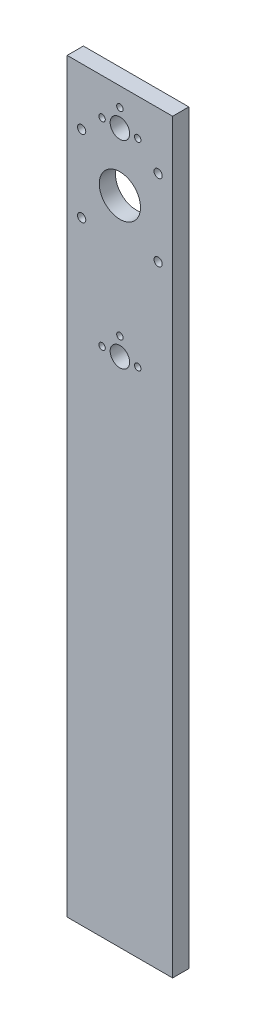
ISO-10303-21;
HEADER;
FILE_DESCRIPTION(('STEP AP214'),'2;1');
FILE_NAME('part.step','',(''),(''),'','','');
FILE_SCHEMA(('AUTOMOTIVE_DESIGN { 1 0 10303 214 1 1 1 1 }'));
ENDSEC;
DATA;
#1=APPLICATION_CONTEXT('core data for automotive mechanical design processes');
#2=APPLICATION_PROTOCOL_DEFINITION('international standard','automotive_design',2000,#1);
#3=PRODUCT_CONTEXT('',#1,'mechanical');
#4=PRODUCT('Part','Part','',(#3));
#5=PRODUCT_RELATED_PRODUCT_CATEGORY('part','',(#4));
#6=PRODUCT_DEFINITION_FORMATION('','',#4);
#7=PRODUCT_DEFINITION_CONTEXT('part definition',#1,'design');
#8=PRODUCT_DEFINITION('design','',#6,#7);
#9=PRODUCT_DEFINITION_SHAPE('','',#8);
#10=(LENGTH_UNIT() NAMED_UNIT(*) SI_UNIT(.MILLI.,.METRE.));
#11=(NAMED_UNIT(*) PLANE_ANGLE_UNIT() SI_UNIT($,.RADIAN.));
#12=(NAMED_UNIT(*) SI_UNIT($,.STERADIAN.) SOLID_ANGLE_UNIT());
#13=UNCERTAINTY_MEASURE_WITH_UNIT(LENGTH_MEASURE(1.E-05),#10,'distance_accuracy_value','');
#14=(GEOMETRIC_REPRESENTATION_CONTEXT(3) GLOBAL_UNCERTAINTY_ASSIGNED_CONTEXT((#13)) GLOBAL_UNIT_ASSIGNED_CONTEXT((#10,
#11,#12)) REPRESENTATION_CONTEXT('',''));
#15=CARTESIAN_POINT('',(0.,0.,0.));
#16=DIRECTION('',(0.,0.,1.));
#17=DIRECTION('',(1.,0.,0.));
#18=AXIS2_PLACEMENT_3D('',#15,#16,#17);
#19=CARTESIAN_POINT('',(-32.5,38.575,10.));
#20=DIRECTION('',(0.,0.,-1.));
#21=DIRECTION('',(-1.,0.,0.));
#22=AXIS2_PLACEMENT_3D('',#19,#20,#21);
#23=PLANE('',#22);
#24=CARTESIAN_POINT('',(-4.25960723338862E-13,27.,10.));
#25=DIRECTION('',(0.,0.,1.));
#26=DIRECTION('',(1.,0.,0.));
#27=AXIS2_PLACEMENT_3D('',#24,#25,#26);
#28=CIRCLE('',#27,2.);
#29=CARTESIAN_POINT('',(1.99999999999957,27.,10.));
#30=VERTEX_POINT('',#29);
#31=EDGE_CURVE('E175',#30,#30,#28,.T.);
#32=ORIENTED_EDGE('',*,*,#31,.F.);
#33=EDGE_LOOP('',(#32));
#34=FACE_BOUND('',#33,.T.);
#35=CARTESIAN_POINT('',(-11.,-106.,10.));
#36=DIRECTION('',(0.,0.,1.));
#37=DIRECTION('',(1.,0.,0.));
#38=AXIS2_PLACEMENT_3D('',#35,#36,#37);
#39=CIRCLE('',#38,2.);
#40=CARTESIAN_POINT('',(-9.,-106.,10.));
#41=VERTEX_POINT('',#40);
#42=EDGE_CURVE('E163',#41,#41,#39,.T.);
#43=ORIENTED_EDGE('',*,*,#42,.F.);
#44=EDGE_LOOP('',(#43));
#45=FACE_BOUND('',#44,.T.);
#46=CARTESIAN_POINT('',(-4.25960723338862E-13,16.,10.));
#47=DIRECTION('',(0.,0.,1.));
#48=DIRECTION('',(1.,0.,0.));
#49=AXIS2_PLACEMENT_3D('',#46,#47,#48);
#50=CIRCLE('',#49,6.);
#51=CARTESIAN_POINT('',(5.99999999999958,16.,10.));
#52=VERTEX_POINT('',#51);
#53=EDGE_CURVE('E151',#52,#52,#50,.T.);
#54=ORIENTED_EDGE('',*,*,#53,.F.);
#55=EDGE_LOOP('',(#54));
#56=FACE_BOUND('',#55,.T.);
#57=CARTESIAN_POINT('',(0.,-106.,10.));
#58=DIRECTION('',(0.,0.,1.));
#59=DIRECTION('',(1.,0.,0.));
#60=AXIS2_PLACEMENT_3D('',#57,#58,#59);
#61=CIRCLE('',#60,6.);
#62=CARTESIAN_POINT('',(6.,-106.,10.));
#63=VERTEX_POINT('',#62);
#64=EDGE_CURVE('E139',#63,#63,#61,.T.);
#65=ORIENTED_EDGE('',*,*,#64,.F.);
#66=EDGE_LOOP('',(#65));
#67=FACE_BOUND('',#66,.T.);
#68=CARTESIAN_POINT('',(-23.5712,-43.5712,10.));
#69=DIRECTION('',(0.,0.,1.));
#70=DIRECTION('',(1.,0.,0.));
#71=AXIS2_PLACEMENT_3D('',#68,#69,#70);
#72=CIRCLE('',#71,2.54);
#73=CARTESIAN_POINT('',(-21.0312,-43.5712,10.));
#74=VERTEX_POINT('',#73);
#75=EDGE_CURVE('E127',#74,#74,#72,.T.);
#76=ORIENTED_EDGE('',*,*,#75,.F.);
#77=EDGE_LOOP('',(#76));
#78=FACE_BOUND('',#77,.T.);
#79=CARTESIAN_POINT('',(23.5712,3.57119999999999,10.));
#80=DIRECTION('',(0.,0.,1.));
#81=DIRECTION('',(1.,0.,0.));
#82=AXIS2_PLACEMENT_3D('',#79,#80,#81);
#83=CIRCLE('',#82,2.54);
#84=CARTESIAN_POINT('',(26.1112,3.57119999999999,10.));
#85=VERTEX_POINT('',#84);
#86=EDGE_CURVE('E115',#85,#85,#83,.T.);
#87=ORIENTED_EDGE('',*,*,#86,.F.);
#88=EDGE_LOOP('',(#87));
#89=FACE_BOUND('',#88,.T.);
#90=DIRECTION('',(0.,-1.,0.));
#91=VECTOR('',#90,1.);
#92=CARTESIAN_POINT('',(-32.5,-421.425,10.));
#93=LINE('',#92,#91);
#94=CARTESIAN_POINT('',(-32.5,38.575,10.));
#95=VERTEX_POINT('',#94);
#96=CARTESIAN_POINT('',(-32.5,-421.425,10.));
#97=VERTEX_POINT('',#96);
#98=EDGE_CURVE('E85',#95,#97,#93,.T.);
#99=ORIENTED_EDGE('',*,*,#98,.T.);
#100=DIRECTION('',(1.,0.,0.));
#101=VECTOR('',#100,1.);
#102=CARTESIAN_POINT('',(-32.5,-421.425,10.));
#103=LINE('',#102,#101);
#104=CARTESIAN_POINT('',(32.5,-421.425,10.));
#105=VERTEX_POINT('',#104);
#106=EDGE_CURVE('E80',#97,#105,#103,.T.);
#107=ORIENTED_EDGE('',*,*,#106,.T.);
#108=DIRECTION('',(0.,1.,0.));
#109=VECTOR('',#108,1.);
#110=CARTESIAN_POINT('',(32.5,-421.425,10.));
#111=LINE('',#110,#109);
#112=CARTESIAN_POINT('',(32.5,38.575,10.));
#113=VERTEX_POINT('',#112);
#114=EDGE_CURVE('E83',#105,#113,#111,.T.);
#115=ORIENTED_EDGE('',*,*,#114,.T.);
#116=DIRECTION('',(-1.,0.,0.));
#117=VECTOR('',#116,1.);
#118=CARTESIAN_POINT('',(-32.5,38.575,10.));
#119=LINE('',#118,#117);
#120=EDGE_CURVE('E50',#113,#95,#119,.T.);
#121=ORIENTED_EDGE('',*,*,#120,.T.);
#122=EDGE_LOOP('',(#99,#107,#115,#121));
#123=FACE_BOUND('',#122,.T.);
#124=CARTESIAN_POINT('',(-23.5712,3.57119999999998,10.));
#125=DIRECTION('',(0.,0.,1.));
#126=DIRECTION('',(1.,0.,0.));
#127=AXIS2_PLACEMENT_3D('',#124,#125,#126);
#128=CIRCLE('',#127,2.54);
#129=CARTESIAN_POINT('',(-21.0312,3.57119999999998,10.));
#130=VERTEX_POINT('',#129);
#131=EDGE_CURVE('E100',#130,#130,#128,.T.);
#132=ORIENTED_EDGE('',*,*,#131,.F.);
#133=EDGE_LOOP('',(#132));
#134=FACE_BOUND('',#133,.T.);
#135=CARTESIAN_POINT('',(23.5712,-43.5712,10.));
#136=DIRECTION('',(0.,0.,1.));
#137=DIRECTION('',(1.,0.,0.));
#138=AXIS2_PLACEMENT_3D('',#135,#136,#137);
#139=CIRCLE('',#138,2.54);
#140=CARTESIAN_POINT('',(26.1112,-43.5712,10.));
#141=VERTEX_POINT('',#140);
#142=EDGE_CURVE('E121',#141,#141,#139,.T.);
#143=ORIENTED_EDGE('',*,*,#142,.F.);
#144=EDGE_LOOP('',(#143));
#145=FACE_BOUND('',#144,.T.);
#146=CARTESIAN_POINT('',(0.,-20.,10.));
#147=DIRECTION('',(0.,0.,1.));
#148=DIRECTION('',(1.,0.,0.));
#149=AXIS2_PLACEMENT_3D('',#146,#147,#148);
#150=CIRCLE('',#149,12.7);
#151=CARTESIAN_POINT('',(12.7,-20.,10.));
#152=VERTEX_POINT('',#151);
#153=EDGE_CURVE('E133',#152,#152,#150,.T.);
#154=ORIENTED_EDGE('',*,*,#153,.F.);
#155=EDGE_LOOP('',(#154));
#156=FACE_BOUND('',#155,.T.);
#157=CARTESIAN_POINT('',(11.,-106.,10.));
#158=DIRECTION('',(0.,0.,1.));
#159=DIRECTION('',(1.,0.,0.));
#160=AXIS2_PLACEMENT_3D('',#157,#158,#159);
#161=CIRCLE('',#160,2.);
#162=CARTESIAN_POINT('',(13.,-106.,10.));
#163=VERTEX_POINT('',#162);
#164=EDGE_CURVE('E145',#163,#163,#161,.T.);
#165=ORIENTED_EDGE('',*,*,#164,.F.);
#166=EDGE_LOOP('',(#165));
#167=FACE_BOUND('',#166,.T.);
#168=CARTESIAN_POINT('',(0.,-95.,10.));
#169=DIRECTION('',(0.,0.,1.));
#170=DIRECTION('',(1.,0.,0.));
#171=AXIS2_PLACEMENT_3D('',#168,#169,#170);
#172=CIRCLE('',#171,2.);
#173=CARTESIAN_POINT('',(2.,-95.,10.));
#174=VERTEX_POINT('',#173);
#175=EDGE_CURVE('E157',#174,#174,#172,.T.);
#176=ORIENTED_EDGE('',*,*,#175,.F.);
#177=EDGE_LOOP('',(#176));
#178=FACE_BOUND('',#177,.T.);
#179=CARTESIAN_POINT('',(10.9999999999996,16.,10.));
#180=DIRECTION('',(0.,0.,1.));
#181=DIRECTION('',(1.,0.,0.));
#182=AXIS2_PLACEMENT_3D('',#179,#180,#181);
#183=CIRCLE('',#182,2.);
#184=CARTESIAN_POINT('',(12.9999999999996,16.,10.));
#185=VERTEX_POINT('',#184);
#186=EDGE_CURVE('E169',#185,#185,#183,.T.);
#187=ORIENTED_EDGE('',*,*,#186,.F.);
#188=EDGE_LOOP('',(#187));
#189=FACE_BOUND('',#188,.T.);
#190=CARTESIAN_POINT('',(-11.0000000000004,16.,10.));
#191=DIRECTION('',(0.,0.,1.));
#192=DIRECTION('',(1.,0.,0.));
#193=AXIS2_PLACEMENT_3D('',#190,#191,#192);
#194=CIRCLE('',#193,2.);
#195=CARTESIAN_POINT('',(-9.00000000000042,16.,10.));
#196=VERTEX_POINT('',#195);
#197=EDGE_CURVE('E181',#196,#196,#194,.T.);
#198=ORIENTED_EDGE('',*,*,#197,.F.);
#199=EDGE_LOOP('',(#198));
#200=FACE_BOUND('',#199,.T.);
#201=ADVANCED_FACE('F33',(#34,#45,#56,#67,#78,#89,#123,#134,#145,#156,#167,#178,#189,#200),#23,.F.);
#202=CARTESIAN_POINT('',(-32.5,38.575,0.));
#203=DIRECTION('',(0.,0.,-1.));
#204=DIRECTION('',(-1.,0.,0.));
#205=AXIS2_PLACEMENT_3D('',#202,#203,#204);
#206=PLANE('',#205);
#207=CARTESIAN_POINT('',(-4.25960723338862E-13,27.,0.));
#208=DIRECTION('',(0.,0.,1.));
#209=DIRECTION('',(1.,0.,0.));
#210=AXIS2_PLACEMENT_3D('',#207,#208,#209);
#211=CIRCLE('',#210,2.);
#212=CARTESIAN_POINT('',(1.99999999999957,27.,0.));
#213=VERTEX_POINT('',#212);
#214=EDGE_CURVE('E178',#213,#213,#211,.T.);
#215=ORIENTED_EDGE('',*,*,#214,.T.);
#216=EDGE_LOOP('',(#215));
#217=FACE_BOUND('',#216,.T.);
#218=CARTESIAN_POINT('',(-11.,-106.,0.));
#219=DIRECTION('',(0.,0.,1.));
#220=DIRECTION('',(1.,0.,0.));
#221=AXIS2_PLACEMENT_3D('',#218,#219,#220);
#222=CIRCLE('',#221,2.);
#223=CARTESIAN_POINT('',(-9.,-106.,0.));
#224=VERTEX_POINT('',#223);
#225=EDGE_CURVE('E166',#224,#224,#222,.T.);
#226=ORIENTED_EDGE('',*,*,#225,.T.);
#227=EDGE_LOOP('',(#226));
#228=FACE_BOUND('',#227,.T.);
#229=CARTESIAN_POINT('',(-4.25960723338862E-13,16.,0.));
#230=DIRECTION('',(0.,0.,1.));
#231=DIRECTION('',(1.,0.,0.));
#232=AXIS2_PLACEMENT_3D('',#229,#230,#231);
#233=CIRCLE('',#232,6.);
#234=CARTESIAN_POINT('',(5.99999999999958,16.,0.));
#235=VERTEX_POINT('',#234);
#236=EDGE_CURVE('E154',#235,#235,#233,.T.);
#237=ORIENTED_EDGE('',*,*,#236,.T.);
#238=EDGE_LOOP('',(#237));
#239=FACE_BOUND('',#238,.T.);
#240=CARTESIAN_POINT('',(0.,-106.,0.));
#241=DIRECTION('',(0.,0.,1.));
#242=DIRECTION('',(1.,0.,0.));
#243=AXIS2_PLACEMENT_3D('',#240,#241,#242);
#244=CIRCLE('',#243,6.);
#245=CARTESIAN_POINT('',(6.,-106.,0.));
#246=VERTEX_POINT('',#245);
#247=EDGE_CURVE('E142',#246,#246,#244,.T.);
#248=ORIENTED_EDGE('',*,*,#247,.T.);
#249=EDGE_LOOP('',(#248));
#250=FACE_BOUND('',#249,.T.);
#251=CARTESIAN_POINT('',(-23.5712,-43.5712,0.));
#252=DIRECTION('',(0.,0.,1.));
#253=DIRECTION('',(1.,0.,0.));
#254=AXIS2_PLACEMENT_3D('',#251,#252,#253);
#255=CIRCLE('',#254,2.54);
#256=CARTESIAN_POINT('',(-21.0312,-43.5712,0.));
#257=VERTEX_POINT('',#256);
#258=EDGE_CURVE('E130',#257,#257,#255,.T.);
#259=ORIENTED_EDGE('',*,*,#258,.T.);
#260=EDGE_LOOP('',(#259));
#261=FACE_BOUND('',#260,.T.);
#262=CARTESIAN_POINT('',(23.5712,3.57119999999999,0.));
#263=DIRECTION('',(0.,0.,1.));
#264=DIRECTION('',(1.,0.,0.));
#265=AXIS2_PLACEMENT_3D('',#262,#263,#264);
#266=CIRCLE('',#265,2.54);
#267=CARTESIAN_POINT('',(26.1112,3.57119999999999,0.));
#268=VERTEX_POINT('',#267);
#269=EDGE_CURVE('E118',#268,#268,#266,.T.);
#270=ORIENTED_EDGE('',*,*,#269,.T.);
#271=EDGE_LOOP('',(#270));
#272=FACE_BOUND('',#271,.T.);
#273=DIRECTION('',(0.,-1.,0.));
#274=VECTOR('',#273,1.);
#275=CARTESIAN_POINT('',(-32.5,-421.425,0.));
#276=LINE('',#275,#274);
#277=CARTESIAN_POINT('',(-32.5,38.575,0.));
#278=VERTEX_POINT('',#277);
#279=CARTESIAN_POINT('',(-32.5,-421.425,0.));
#280=VERTEX_POINT('',#279);
#281=EDGE_CURVE('E97',#278,#280,#276,.T.);
#282=ORIENTED_EDGE('',*,*,#281,.F.);
#283=DIRECTION('',(-1.,0.,0.));
#284=VECTOR('',#283,1.);
#285=CARTESIAN_POINT('',(-32.5,38.575,0.));
#286=LINE('',#285,#284);
#287=CARTESIAN_POINT('',(32.5,38.575,0.));
#288=VERTEX_POINT('',#287);
#289=EDGE_CURVE('E73',#288,#278,#286,.T.);
#290=ORIENTED_EDGE('',*,*,#289,.F.);
#291=DIRECTION('',(0.,1.,0.));
#292=VECTOR('',#291,1.);
#293=CARTESIAN_POINT('',(32.5,-421.425,0.));
#294=LINE('',#293,#292);
#295=CARTESIAN_POINT('',(32.5,-421.425,0.));
#296=VERTEX_POINT('',#295);
#297=EDGE_CURVE('E67',#296,#288,#294,.T.);
#298=ORIENTED_EDGE('',*,*,#297,.F.);
#299=DIRECTION('',(1.,0.,0.));
#300=VECTOR('',#299,1.);
#301=CARTESIAN_POINT('',(-32.5,-421.425,0.));
#302=LINE('',#301,#300);
#303=EDGE_CURVE('E89',#280,#296,#302,.T.);
#304=ORIENTED_EDGE('',*,*,#303,.F.);
#305=EDGE_LOOP('',(#282,#290,#298,#304));
#306=FACE_BOUND('',#305,.T.);
#307=CARTESIAN_POINT('',(-23.5712,3.57119999999998,0.));
#308=DIRECTION('',(0.,0.,1.));
#309=DIRECTION('',(1.,0.,0.));
#310=AXIS2_PLACEMENT_3D('',#307,#308,#309);
#311=CIRCLE('',#310,2.54);
#312=CARTESIAN_POINT('',(-21.0312,3.57119999999998,0.));
#313=VERTEX_POINT('',#312);
#314=EDGE_CURVE('E112',#313,#313,#311,.T.);
#315=ORIENTED_EDGE('',*,*,#314,.T.);
#316=EDGE_LOOP('',(#315));
#317=FACE_BOUND('',#316,.T.);
#318=CARTESIAN_POINT('',(23.5712,-43.5712,0.));
#319=DIRECTION('',(0.,0.,1.));
#320=DIRECTION('',(1.,0.,0.));
#321=AXIS2_PLACEMENT_3D('',#318,#319,#320);
#322=CIRCLE('',#321,2.54);
#323=CARTESIAN_POINT('',(26.1112,-43.5712,0.));
#324=VERTEX_POINT('',#323);
#325=EDGE_CURVE('E124',#324,#324,#322,.T.);
#326=ORIENTED_EDGE('',*,*,#325,.T.);
#327=EDGE_LOOP('',(#326));
#328=FACE_BOUND('',#327,.T.);
#329=CARTESIAN_POINT('',(0.,-20.,0.));
#330=DIRECTION('',(0.,0.,1.));
#331=DIRECTION('',(1.,0.,0.));
#332=AXIS2_PLACEMENT_3D('',#329,#330,#331);
#333=CIRCLE('',#332,12.7);
#334=CARTESIAN_POINT('',(12.7,-20.,0.));
#335=VERTEX_POINT('',#334);
#336=EDGE_CURVE('E136',#335,#335,#333,.T.);
#337=ORIENTED_EDGE('',*,*,#336,.T.);
#338=EDGE_LOOP('',(#337));
#339=FACE_BOUND('',#338,.T.);
#340=CARTESIAN_POINT('',(11.,-106.,0.));
#341=DIRECTION('',(0.,0.,1.));
#342=DIRECTION('',(1.,0.,0.));
#343=AXIS2_PLACEMENT_3D('',#340,#341,#342);
#344=CIRCLE('',#343,2.);
#345=CARTESIAN_POINT('',(13.,-106.,0.));
#346=VERTEX_POINT('',#345);
#347=EDGE_CURVE('E148',#346,#346,#344,.T.);
#348=ORIENTED_EDGE('',*,*,#347,.T.);
#349=EDGE_LOOP('',(#348));
#350=FACE_BOUND('',#349,.T.);
#351=CARTESIAN_POINT('',(0.,-95.,0.));
#352=DIRECTION('',(0.,0.,1.));
#353=DIRECTION('',(1.,0.,0.));
#354=AXIS2_PLACEMENT_3D('',#351,#352,#353);
#355=CIRCLE('',#354,2.);
#356=CARTESIAN_POINT('',(2.,-95.,0.));
#357=VERTEX_POINT('',#356);
#358=EDGE_CURVE('E160',#357,#357,#355,.T.);
#359=ORIENTED_EDGE('',*,*,#358,.T.);
#360=EDGE_LOOP('',(#359));
#361=FACE_BOUND('',#360,.T.);
#362=CARTESIAN_POINT('',(10.9999999999996,16.,0.));
#363=DIRECTION('',(0.,0.,1.));
#364=DIRECTION('',(1.,0.,0.));
#365=AXIS2_PLACEMENT_3D('',#362,#363,#364);
#366=CIRCLE('',#365,2.);
#367=CARTESIAN_POINT('',(12.9999999999996,16.,0.));
#368=VERTEX_POINT('',#367);
#369=EDGE_CURVE('E172',#368,#368,#366,.T.);
#370=ORIENTED_EDGE('',*,*,#369,.T.);
#371=EDGE_LOOP('',(#370));
#372=FACE_BOUND('',#371,.T.);
#373=CARTESIAN_POINT('',(-11.0000000000004,16.,0.));
#374=DIRECTION('',(0.,0.,1.));
#375=DIRECTION('',(1.,0.,0.));
#376=AXIS2_PLACEMENT_3D('',#373,#374,#375);
#377=CIRCLE('',#376,2.);
#378=CARTESIAN_POINT('',(-9.00000000000042,16.,0.));
#379=VERTEX_POINT('',#378);
#380=EDGE_CURVE('E184',#379,#379,#377,.T.);
#381=ORIENTED_EDGE('',*,*,#380,.T.);
#382=EDGE_LOOP('',(#381));
#383=FACE_BOUND('',#382,.T.);
#384=ADVANCED_FACE('F108',(#217,#228,#239,#250,#261,#272,#306,#317,#328,#339,#350,#361,#372,
#383),#206,.T.);
#385=CARTESIAN_POINT('',(-32.5,-421.425,10.));
#386=DIRECTION('',(1.,0.,0.));
#387=DIRECTION('',(0.,0.,-1.));
#388=AXIS2_PLACEMENT_3D('',#385,#386,#387);
#389=PLANE('',#388);
#390=ORIENTED_EDGE('',*,*,#281,.T.);
#391=DIRECTION('',(0.,0.,-1.));
#392=VECTOR('',#391,1.);
#393=CARTESIAN_POINT('',(-32.5,-421.425,10.));
#394=LINE('',#393,#392);
#395=EDGE_CURVE('E11',#97,#280,#394,.T.);
#396=ORIENTED_EDGE('',*,*,#395,.F.);
#397=ORIENTED_EDGE('',*,*,#98,.F.);
#398=DIRECTION('',(0.,0.,-1.));
#399=VECTOR('',#398,1.);
#400=CARTESIAN_POINT('',(-32.5,38.575,10.));
#401=LINE('',#400,#399);
#402=EDGE_CURVE('E93',#95,#278,#401,.T.);
#403=ORIENTED_EDGE('',*,*,#402,.T.);
#404=EDGE_LOOP('',(#390,#396,#397,#403));
#405=FACE_BOUND('',#404,.T.);
#406=ADVANCED_FACE('F35',(#405),#389,.F.);
#407=CARTESIAN_POINT('',(-32.5,-421.425,10.));
#408=DIRECTION('',(0.,1.,0.));
#409=DIRECTION('',(0.,0.,1.));
#410=AXIS2_PLACEMENT_3D('',#407,#408,#409);
#411=PLANE('',#410);
#412=ORIENTED_EDGE('',*,*,#303,.T.);
#413=DIRECTION('',(0.,0.,-1.));
#414=VECTOR('',#413,1.);
#415=CARTESIAN_POINT('',(32.5,-421.425,10.));
#416=LINE('',#415,#414);
#417=EDGE_CURVE('E42',#105,#296,#416,.T.);
#418=ORIENTED_EDGE('',*,*,#417,.F.);
#419=ORIENTED_EDGE('',*,*,#106,.F.);
#420=ORIENTED_EDGE('',*,*,#395,.T.);
#421=EDGE_LOOP('',(#412,#418,#419,#420));
#422=FACE_BOUND('',#421,.T.);
#423=ADVANCED_FACE('F88',(#422),#411,.F.);
#424=CARTESIAN_POINT('',(32.5,-421.425,10.));
#425=DIRECTION('',(-1.,0.,0.));
#426=DIRECTION('',(0.,0.,1.));
#427=AXIS2_PLACEMENT_3D('',#424,#425,#426);
#428=PLANE('',#427);
#429=ORIENTED_EDGE('',*,*,#297,.T.);
#430=DIRECTION('',(0.,0.,-1.));
#431=VECTOR('',#430,1.);
#432=CARTESIAN_POINT('',(32.5,38.575,10.));
#433=LINE('',#432,#431);
#434=EDGE_CURVE('E90',#113,#288,#433,.T.);
#435=ORIENTED_EDGE('',*,*,#434,.F.);
#436=ORIENTED_EDGE('',*,*,#114,.F.);
#437=ORIENTED_EDGE('',*,*,#417,.T.);
#438=EDGE_LOOP('',(#429,#435,#436,#437));
#439=FACE_BOUND('',#438,.T.);
#440=ADVANCED_FACE('F91',(#439),#428,.F.);
#441=CARTESIAN_POINT('',(-32.5,38.575,10.));
#442=DIRECTION('',(0.,-1.,0.));
#443=DIRECTION('',(0.,0.,-1.));
#444=AXIS2_PLACEMENT_3D('',#441,#442,#443);
#445=PLANE('',#444);
#446=ORIENTED_EDGE('',*,*,#289,.T.);
#447=ORIENTED_EDGE('',*,*,#402,.F.);
#448=ORIENTED_EDGE('',*,*,#120,.F.);
#449=ORIENTED_EDGE('',*,*,#434,.T.);
#450=EDGE_LOOP('',(#446,#447,#448,#449));
#451=FACE_BOUND('',#450,.T.);
#452=ADVANCED_FACE('F105',(#451),#445,.F.);
#453=CARTESIAN_POINT('',(-23.5712,3.57119999999998,10.));
#454=DIRECTION('',(0.,0.,-1.));
#455=DIRECTION('',(-1.,0.,0.));
#456=AXIS2_PLACEMENT_3D('',#453,#454,#455);
#457=CYLINDRICAL_SURFACE('',#456,2.54);
#458=ORIENTED_EDGE('',*,*,#131,.T.);
#459=EDGE_LOOP('',(#458));
#460=FACE_BOUND('',#459,.T.);
#461=ORIENTED_EDGE('',*,*,#314,.F.);
#462=EDGE_LOOP('',(#461));
#463=FACE_BOUND('',#462,.T.);
#464=ADVANCED_FACE('F204',(#460,#463),#457,.F.);
#465=CARTESIAN_POINT('',(23.5712,3.57119999999999,10.));
#466=DIRECTION('',(0.,0.,-1.));
#467=DIRECTION('',(-1.,0.,0.));
#468=AXIS2_PLACEMENT_3D('',#465,#466,#467);
#469=CYLINDRICAL_SURFACE('',#468,2.54);
#470=ORIENTED_EDGE('',*,*,#86,.T.);
#471=EDGE_LOOP('',(#470));
#472=FACE_BOUND('',#471,.T.);
#473=ORIENTED_EDGE('',*,*,#269,.F.);
#474=EDGE_LOOP('',(#473));
#475=FACE_BOUND('',#474,.T.);
#476=ADVANCED_FACE('F250',(#472,#475),#469,.F.);
#477=CARTESIAN_POINT('',(23.5712,-43.5712,10.));
#478=DIRECTION('',(0.,0.,-1.));
#479=DIRECTION('',(-1.,0.,0.));
#480=AXIS2_PLACEMENT_3D('',#477,#478,#479);
#481=CYLINDRICAL_SURFACE('',#480,2.54);
#482=ORIENTED_EDGE('',*,*,#142,.T.);
#483=EDGE_LOOP('',(#482));
#484=FACE_BOUND('',#483,.T.);
#485=ORIENTED_EDGE('',*,*,#325,.F.);
#486=EDGE_LOOP('',(#485));
#487=FACE_BOUND('',#486,.T.);
#488=ADVANCED_FACE('F258',(#484,#487),#481,.F.);
#489=CARTESIAN_POINT('',(-23.5712,-43.5712,10.));
#490=DIRECTION('',(0.,0.,-1.));
#491=DIRECTION('',(-1.,0.,0.));
#492=AXIS2_PLACEMENT_3D('',#489,#490,#491);
#493=CYLINDRICAL_SURFACE('',#492,2.54);
#494=ORIENTED_EDGE('',*,*,#75,.T.);
#495=EDGE_LOOP('',(#494));
#496=FACE_BOUND('',#495,.T.);
#497=ORIENTED_EDGE('',*,*,#258,.F.);
#498=EDGE_LOOP('',(#497));
#499=FACE_BOUND('',#498,.T.);
#500=ADVANCED_FACE('F266',(#496,#499),#493,.F.);
#501=CARTESIAN_POINT('',(0.,-20.,10.));
#502=DIRECTION('',(0.,0.,-1.));
#503=DIRECTION('',(-1.,0.,0.));
#504=AXIS2_PLACEMENT_3D('',#501,#502,#503);
#505=CYLINDRICAL_SURFACE('',#504,12.7);
#506=ORIENTED_EDGE('',*,*,#153,.T.);
#507=EDGE_LOOP('',(#506));
#508=FACE_BOUND('',#507,.T.);
#509=ORIENTED_EDGE('',*,*,#336,.F.);
#510=EDGE_LOOP('',(#509));
#511=FACE_BOUND('',#510,.T.);
#512=ADVANCED_FACE('F275',(#508,#511),#505,.F.);
#513=CARTESIAN_POINT('',(0.,-106.,10.));
#514=DIRECTION('',(0.,0.,-1.));
#515=DIRECTION('',(-1.,0.,0.));
#516=AXIS2_PLACEMENT_3D('',#513,#514,#515);
#517=CYLINDRICAL_SURFACE('',#516,6.);
#518=ORIENTED_EDGE('',*,*,#64,.T.);
#519=EDGE_LOOP('',(#518));
#520=FACE_BOUND('',#519,.T.);
#521=ORIENTED_EDGE('',*,*,#247,.F.);
#522=EDGE_LOOP('',(#521));
#523=FACE_BOUND('',#522,.T.);
#524=ADVANCED_FACE('F284',(#520,#523),#517,.F.);
#525=CARTESIAN_POINT('',(11.,-106.,10.));
#526=DIRECTION('',(0.,0.,-1.));
#527=DIRECTION('',(-1.,0.,0.));
#528=AXIS2_PLACEMENT_3D('',#525,#526,#527);
#529=CYLINDRICAL_SURFACE('',#528,2.);
#530=ORIENTED_EDGE('',*,*,#164,.T.);
#531=EDGE_LOOP('',(#530));
#532=FACE_BOUND('',#531,.T.);
#533=ORIENTED_EDGE('',*,*,#347,.F.);
#534=EDGE_LOOP('',(#533));
#535=FACE_BOUND('',#534,.T.);
#536=ADVANCED_FACE('F293',(#532,#535),#529,.F.);
#537=CARTESIAN_POINT('',(-4.25960723338862E-13,16.,10.));
#538=DIRECTION('',(0.,0.,-1.));
#539=DIRECTION('',(-1.,0.,0.));
#540=AXIS2_PLACEMENT_3D('',#537,#538,#539);
#541=CYLINDRICAL_SURFACE('',#540,6.);
#542=ORIENTED_EDGE('',*,*,#53,.T.);
#543=EDGE_LOOP('',(#542));
#544=FACE_BOUND('',#543,.T.);
#545=ORIENTED_EDGE('',*,*,#236,.F.);
#546=EDGE_LOOP('',(#545));
#547=FACE_BOUND('',#546,.T.);
#548=ADVANCED_FACE('F302',(#544,#547),#541,.F.);
#549=CARTESIAN_POINT('',(0.,-95.,10.));
#550=DIRECTION('',(0.,0.,-1.));
#551=DIRECTION('',(-1.,0.,0.));
#552=AXIS2_PLACEMENT_3D('',#549,#550,#551);
#553=CYLINDRICAL_SURFACE('',#552,2.);
#554=ORIENTED_EDGE('',*,*,#175,.T.);
#555=EDGE_LOOP('',(#554));
#556=FACE_BOUND('',#555,.T.);
#557=ORIENTED_EDGE('',*,*,#358,.F.);
#558=EDGE_LOOP('',(#557));
#559=FACE_BOUND('',#558,.T.);
#560=ADVANCED_FACE('F311',(#556,#559),#553,.F.);
#561=CARTESIAN_POINT('',(-11.,-106.,10.));
#562=DIRECTION('',(0.,0.,-1.));
#563=DIRECTION('',(-1.,0.,0.));
#564=AXIS2_PLACEMENT_3D('',#561,#562,#563);
#565=CYLINDRICAL_SURFACE('',#564,2.);
#566=ORIENTED_EDGE('',*,*,#42,.T.);
#567=EDGE_LOOP('',(#566));
#568=FACE_BOUND('',#567,.T.);
#569=ORIENTED_EDGE('',*,*,#225,.F.);
#570=EDGE_LOOP('',(#569));
#571=FACE_BOUND('',#570,.T.);
#572=ADVANCED_FACE('F320',(#568,#571),#565,.F.);
#573=CARTESIAN_POINT('',(10.9999999999996,16.,10.));
#574=DIRECTION('',(0.,0.,-1.));
#575=DIRECTION('',(-1.,0.,0.));
#576=AXIS2_PLACEMENT_3D('',#573,#574,#575);
#577=CYLINDRICAL_SURFACE('',#576,2.);
#578=ORIENTED_EDGE('',*,*,#186,.T.);
#579=EDGE_LOOP('',(#578));
#580=FACE_BOUND('',#579,.T.);
#581=ORIENTED_EDGE('',*,*,#369,.F.);
#582=EDGE_LOOP('',(#581));
#583=FACE_BOUND('',#582,.T.);
#584=ADVANCED_FACE('F329',(#580,#583),#577,.F.);
#585=CARTESIAN_POINT('',(-4.25960723338862E-13,27.,10.));
#586=DIRECTION('',(0.,0.,-1.));
#587=DIRECTION('',(-1.,0.,0.));
#588=AXIS2_PLACEMENT_3D('',#585,#586,#587);
#589=CYLINDRICAL_SURFACE('',#588,2.);
#590=ORIENTED_EDGE('',*,*,#31,.T.);
#591=EDGE_LOOP('',(#590));
#592=FACE_BOUND('',#591,.T.);
#593=ORIENTED_EDGE('',*,*,#214,.F.);
#594=EDGE_LOOP('',(#593));
#595=FACE_BOUND('',#594,.T.);
#596=ADVANCED_FACE('F338',(#592,#595),#589,.F.);
#597=CARTESIAN_POINT('',(-11.0000000000004,16.,10.));
#598=DIRECTION('',(0.,0.,-1.));
#599=DIRECTION('',(-1.,0.,0.));
#600=AXIS2_PLACEMENT_3D('',#597,#598,#599);
#601=CYLINDRICAL_SURFACE('',#600,2.);
#602=ORIENTED_EDGE('',*,*,#197,.T.);
#603=EDGE_LOOP('',(#602));
#604=FACE_BOUND('',#603,.T.);
#605=ORIENTED_EDGE('',*,*,#380,.F.);
#606=EDGE_LOOP('',(#605));
#607=FACE_BOUND('',#606,.T.);
#608=ADVANCED_FACE('F190',(#604,#607),#601,.F.);
#609=CLOSED_SHELL('',(#201,#384,#406,#423,#440,#452,#464,#476,#488,#500,#512,#524,#536,#548,
#560,#572,#584,#596,#608));
#610=MANIFOLD_SOLID_BREP('B2',#609);
#611=ADVANCED_BREP_SHAPE_REPRESENTATION('',(#18,#610),#14);
#612=SHAPE_DEFINITION_REPRESENTATION(#9,#611);
ENDSEC;
END-ISO-10303-21;
